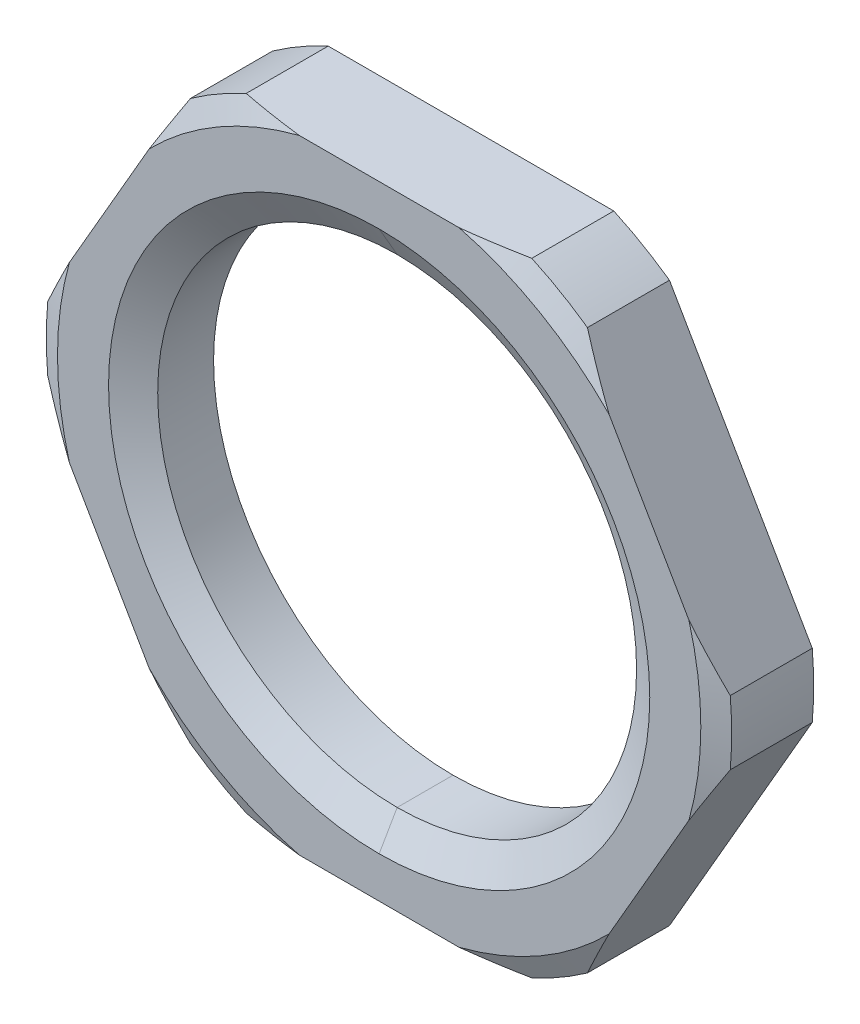
ISO-10303-21;
HEADER;
FILE_DESCRIPTION(('STEP AP214'),'2;1');
FILE_NAME('part.step','',(''),(''),'','','');
FILE_SCHEMA(('AUTOMOTIVE_DESIGN { 1 0 10303 214 1 1 1 1 }'));
ENDSEC;
DATA;
#1=APPLICATION_CONTEXT('core data for automotive mechanical design processes');
#2=APPLICATION_PROTOCOL_DEFINITION('international standard','automotive_design',2000,#1);
#3=PRODUCT_CONTEXT('',#1,'mechanical');
#4=PRODUCT('Part','Part','',(#3));
#5=PRODUCT_RELATED_PRODUCT_CATEGORY('part','',(#4));
#6=PRODUCT_DEFINITION_FORMATION('','',#4);
#7=PRODUCT_DEFINITION_CONTEXT('part definition',#1,'design');
#8=PRODUCT_DEFINITION('design','',#6,#7);
#9=PRODUCT_DEFINITION_SHAPE('','',#8);
#10=(LENGTH_UNIT() NAMED_UNIT(*) SI_UNIT(.MILLI.,.METRE.));
#11=(NAMED_UNIT(*) PLANE_ANGLE_UNIT() SI_UNIT($,.RADIAN.));
#12=(NAMED_UNIT(*) SI_UNIT($,.STERADIAN.) SOLID_ANGLE_UNIT());
#13=UNCERTAINTY_MEASURE_WITH_UNIT(LENGTH_MEASURE(1.E-05),#10,'distance_accuracy_value','');
#14=(GEOMETRIC_REPRESENTATION_CONTEXT(3) GLOBAL_UNCERTAINTY_ASSIGNED_CONTEXT((#13)) GLOBAL_UNIT_ASSIGNED_CONTEXT((#10,
#11,#12)) REPRESENTATION_CONTEXT('',''));
#15=CARTESIAN_POINT('',(0.,0.,0.));
#16=DIRECTION('',(0.,0.,1.));
#17=DIRECTION('',(1.,0.,0.));
#18=AXIS2_PLACEMENT_3D('',#15,#16,#17);
#19=CARTESIAN_POINT('',(10.40396479106,-0.979804381733,0.));
#20=DIRECTION('',(-0.866025403784429,0.500000000000017,0.));
#21=DIRECTION('',(0.,0.,1.));
#22=AXIS2_PLACEMENT_3D('',#19,#20,#21);
#23=PLANE('',#22);
#24=DIRECTION('',(-0.500000000000017,-0.866025403784429,0.));
#25=VECTOR('',#24,1.);
#26=CARTESIAN_POINT('',(9.443829136143,-2.642808118201,0.));
#27=LINE('',#26,#25);
#28=CARTESIAN_POINT('',(9.443829136143,-2.642808118201,0.));
#29=VERTEX_POINT('',#28);
#30=CARTESIAN_POINT('',(7.010653535761,-6.857191881799,0.));
#31=VERTEX_POINT('',#30);
#32=EDGE_CURVE('E427',#29,#31,#27,.T.);
#33=ORIENTED_EDGE('',*,*,#32,.T.);
#34=CARTESIAN_POINT('',(7.010653535761,-6.857191881799,0.));
#35=CARTESIAN_POINT('',(6.904427587513,-7.041180621247,-0.02458023492335));
#36=CARTESIAN_POINT('',(6.69169985566,-7.409635860995,-0.07986290593623));
#37=CARTESIAN_POINT('',(6.372595744954,-7.962340393642,-0.1799982415506));
#38=CARTESIAN_POINT('',(6.158086116641,-8.333881968593,-0.2582069995434));
#39=CARTESIAN_POINT('',(6.050517880848,-8.520195618267,-0.3));
#40=(BOUNDED_CURVE() B_SPLINE_CURVE(3,(#34,#35,#36,#37,#38,#39),.UNSPECIFIED.,.F.,
.F.) B_SPLINE_CURVE_WITH_KNOTS((4,1,1,4),(0.,0.3333333333333,0.6666666666667,1.),
.UNSPECIFIED.) CURVE() GEOMETRIC_REPRESENTATION_ITEM() RATIONAL_B_SPLINE_CURVE((1.,1.,1.,1.,1.,1.)) REPRESENTATION_ITEM(''));
#41=CARTESIAN_POINT('',(6.050517880848,-8.520195618267,-0.3));
#42=VERTEX_POINT('',#41);
#43=EDGE_CURVE('E417',#31,#42,#40,.T.);
#44=ORIENTED_EDGE('',*,*,#43,.T.);
#45=DIRECTION('',(0.,0.,-1.));
#46=VECTOR('',#45,1.);
#47=CARTESIAN_POINT('',(6.050517880848,-8.520195618267,-0.3));
#48=LINE('',#47,#46);
#49=CARTESIAN_POINT('',(6.050517880848,-8.520195618267,-2.8));
#50=VERTEX_POINT('',#49);
#51=EDGE_CURVE('E27',#42,#50,#48,.T.);
#52=ORIENTED_EDGE('',*,*,#51,.T.);
#53=DIRECTION('',(-0.500000000000017,-0.866025403784429,0.));
#54=VECTOR('',#53,1.);
#55=CARTESIAN_POINT('',(10.40396479106,-0.9798043817329,-2.8));
#56=LINE('',#55,#54);
#57=CARTESIAN_POINT('',(10.40396479106,-0.9798043817329,-2.8));
#58=VERTEX_POINT('',#57);
#59=EDGE_CURVE('E402',#58,#50,#56,.T.);
#60=ORIENTED_EDGE('',*,*,#59,.F.);
#61=DIRECTION('',(0.,0.,-1.));
#62=VECTOR('',#61,1.);
#63=CARTESIAN_POINT('',(10.40396479106,-0.9798043817329,-0.3));
#64=LINE('',#63,#62);
#65=CARTESIAN_POINT('',(10.40396479106,-0.9798043817329,-0.3));
#66=VERTEX_POINT('',#65);
#67=EDGE_CURVE('E433',#66,#58,#64,.T.);
#68=ORIENTED_EDGE('',*,*,#67,.F.);
#69=CARTESIAN_POINT('',(10.40396479106,-0.9798043817329,-0.3));
#70=CARTESIAN_POINT('',(10.29618146146,-1.166490584795,-0.2581234301219));
#71=CARTESIAN_POINT('',(10.08138362109,-1.538531357676,-0.1798240738233));
#72=CARTESIAN_POINT('',(9.762323554424,-2.091159603811,-0.07973500268764));
#73=CARTESIAN_POINT('',(9.549857941795,-2.459160839745,-0.02453461696096));
#74=CARTESIAN_POINT('',(9.443829136143,-2.642808118201,0.));
#75=(BOUNDED_CURVE() B_SPLINE_CURVE(3,(#69,#70,#71,#72,#73,#74),.UNSPECIFIED.,.F.,
.F.) B_SPLINE_CURVE_WITH_KNOTS((4,1,1,4),(0.,0.3333333333333,0.6666666666667,1.),
.UNSPECIFIED.) CURVE() GEOMETRIC_REPRESENTATION_ITEM() RATIONAL_B_SPLINE_CURVE((1.,1.,1.,1.,1.,1.)) REPRESENTATION_ITEM(''));
#76=EDGE_CURVE('E409',#66,#29,#75,.T.);
#77=ORIENTED_EDGE('',*,*,#76,.T.);
#78=EDGE_LOOP('',(#33,#44,#52,#60,#68,#77));
#79=FACE_BOUND('',#78,.T.);
#80=ADVANCED_FACE('F16',(#79),#23,.F.);
#81=CARTESIAN_POINT('',(6.050517880848,8.520195618267,0.));
#82=DIRECTION('',(-0.866025403784429,-0.500000000000017,0.));
#83=DIRECTION('',(-0.500000000000017,0.866025403784429,0.));
#84=AXIS2_PLACEMENT_3D('',#81,#82,#83);
#85=PLANE('',#84);
#86=DIRECTION('',(0.500000000000017,-0.866025403784429,0.));
#87=VECTOR('',#86,1.);
#88=CARTESIAN_POINT('',(7.010653535761,6.857191881799,0.));
#89=LINE('',#88,#87);
#90=CARTESIAN_POINT('',(7.010653535761,6.857191881799,0.));
#91=VERTEX_POINT('',#90);
#92=CARTESIAN_POINT('',(9.443829136143,2.642808118201,0.));
#93=VERTEX_POINT('',#92);
#94=EDGE_CURVE('E342',#91,#93,#89,.T.);
#95=ORIENTED_EDGE('',*,*,#94,.T.);
#96=CARTESIAN_POINT('',(9.443829136143,2.642808118201,0.));
#97=CARTESIAN_POINT('',(9.550055084391,2.458819378753,-0.02458023492335));
#98=CARTESIAN_POINT('',(9.762782816244,2.090364139005,-0.07986290593623));
#99=CARTESIAN_POINT('',(10.08188692695,1.537659606358,-0.1799982415506));
#100=CARTESIAN_POINT('',(10.29639655526,1.166118031407,-0.2582069995434));
#101=CARTESIAN_POINT('',(10.40396479106,0.979804381733,-0.3));
#102=(BOUNDED_CURVE() B_SPLINE_CURVE(3,(#96,#97,#98,#99,#100,#101),.UNSPECIFIED.,.F.,
.F.) B_SPLINE_CURVE_WITH_KNOTS((4,1,1,4),(0.,0.3333333333333,0.6666666666667,1.),
.UNSPECIFIED.) CURVE() GEOMETRIC_REPRESENTATION_ITEM() RATIONAL_B_SPLINE_CURVE((1.,1.,1.,1.,1.,1.)) REPRESENTATION_ITEM(''));
#103=CARTESIAN_POINT('',(10.40396479106,0.979804381733,-0.3));
#104=VERTEX_POINT('',#103);
#105=EDGE_CURVE('E356',#93,#104,#102,.T.);
#106=ORIENTED_EDGE('',*,*,#105,.T.);
#107=DIRECTION('',(0.,0.,-1.));
#108=VECTOR('',#107,1.);
#109=CARTESIAN_POINT('',(10.40396479106,0.979804381733,-0.3));
#110=LINE('',#109,#108);
#111=CARTESIAN_POINT('',(10.40396479106,0.9798043817329,-2.8));
#112=VERTEX_POINT('',#111);
#113=EDGE_CURVE('E372',#104,#112,#110,.T.);
#114=ORIENTED_EDGE('',*,*,#113,.T.);
#115=DIRECTION('',(0.500000000000017,-0.866025403784429,0.));
#116=VECTOR('',#115,1.);
#117=CARTESIAN_POINT('',(6.050517880848,8.520195618267,-2.8));
#118=LINE('',#117,#116);
#119=CARTESIAN_POINT('',(6.050517880848,8.520195618267,-2.8));
#120=VERTEX_POINT('',#119);
#121=EDGE_CURVE('E330',#120,#112,#118,.T.);
#122=ORIENTED_EDGE('',*,*,#121,.F.);
#123=DIRECTION('',(0.,0.,-1.));
#124=VECTOR('',#123,1.);
#125=CARTESIAN_POINT('',(6.050517880848,8.520195618267,-0.3));
#126=LINE('',#125,#124);
#127=CARTESIAN_POINT('',(6.050517880848,8.520195618267,-0.3));
#128=VERTEX_POINT('',#127);
#129=EDGE_CURVE('E11',#128,#120,#126,.T.);
#130=ORIENTED_EDGE('',*,*,#129,.F.);
#131=CARTESIAN_POINT('',(6.050517880848,8.520195618267,-0.3));
#132=CARTESIAN_POINT('',(6.15830121044,8.333509415205,-0.2581234301219));
#133=CARTESIAN_POINT('',(6.373099050813,7.961468642324,-0.1798240738233));
#134=CARTESIAN_POINT('',(6.69215911748,7.408840396189,-0.07973500268764));
#135=CARTESIAN_POINT('',(6.904624730109,7.040839160255,-0.02453461696096));
#136=CARTESIAN_POINT('',(7.010653535761,6.857191881799,0.));
#137=(BOUNDED_CURVE() B_SPLINE_CURVE(3,(#131,#132,#133,#134,#135,#136),.UNSPECIFIED.,.F.,
.F.) B_SPLINE_CURVE_WITH_KNOTS((4,1,1,4),(0.,0.3333333333333,0.6666666666667,1.),
.UNSPECIFIED.) CURVE() GEOMETRIC_REPRESENTATION_ITEM() RATIONAL_B_SPLINE_CURVE((1.,1.,1.,1.,1.,1.)) REPRESENTATION_ITEM(''));
#138=EDGE_CURVE('E263',#128,#91,#137,.T.);
#139=ORIENTED_EDGE('',*,*,#138,.T.);
#140=EDGE_LOOP('',(#95,#106,#114,#122,#130,#139));
#141=FACE_BOUND('',#140,.T.);
#142=ADVANCED_FACE('F527',(#141),#85,.F.);
#143=CARTESIAN_POINT('',(0.,0.,0.14));
#144=DIRECTION('',(0.,0.,-1.));
#145=DIRECTION('',(0.,-1.,0.));
#146=AXIS2_PLACEMENT_3D('',#143,#144,#145);
#147=CYLINDRICAL_SURFACE('',#146,10.45);
#148=ORIENTED_EDGE('',*,*,#129,.T.);
#149=CARTESIAN_POINT('',(0.,0.,-2.8));
#150=DIRECTION('',(0.,0.,-1.));
#151=DIRECTION('',(0.416597790450509,0.909090909090919,0.));
#152=AXIS2_PLACEMENT_3D('',#149,#150,#151);
#153=CIRCLE('',#152,10.45);
#154=CARTESIAN_POINT('',(4.353446910208,9.5,-2.8));
#155=VERTEX_POINT('',#154);
#156=EDGE_CURVE('E246',#155,#120,#153,.T.);
#157=ORIENTED_EDGE('',*,*,#156,.F.);
#158=DIRECTION('',(0.,0.,-1.));
#159=VECTOR('',#158,1.);
#160=CARTESIAN_POINT('',(4.353446910208,9.5,-0.3));
#161=LINE('',#160,#159);
#162=CARTESIAN_POINT('',(4.353446910208,9.5,-0.3));
#163=VERTEX_POINT('',#162);
#164=EDGE_CURVE('E170',#163,#155,#161,.T.);
#165=ORIENTED_EDGE('',*,*,#164,.F.);
#166=CARTESIAN_POINT('',(0.,0.,-0.3));
#167=DIRECTION('',(0.,0.,-1.));
#168=DIRECTION('',(0.416597790450509,0.909090909090919,0.));
#169=AXIS2_PLACEMENT_3D('',#166,#167,#168);
#170=CIRCLE('',#169,10.45);
#171=EDGE_CURVE('E254',#163,#128,#170,.T.);
#172=ORIENTED_EDGE('',*,*,#171,.T.);
#173=EDGE_LOOP('',(#148,#157,#165,#172));
#174=FACE_BOUND('',#173,.T.);
#175=ADVANCED_FACE('F584',(#174),#147,.T.);
#176=CARTESIAN_POINT('',(0.,0.,0.14));
#177=DIRECTION('',(0.,0.,-1.));
#178=DIRECTION('',(0.,-1.,0.));
#179=AXIS2_PLACEMENT_3D('',#176,#177,#178);
#180=CYLINDRICAL_SURFACE('',#179,10.45);
#181=DIRECTION('',(0.,0.,-1.));
#182=VECTOR('',#181,1.);
#183=CARTESIAN_POINT('',(4.353446910208,-9.5,-0.3));
#184=LINE('',#183,#182);
#185=CARTESIAN_POINT('',(4.353446910208,-9.5,-0.3));
#186=VERTEX_POINT('',#185);
#187=CARTESIAN_POINT('',(4.353446910208,-9.5,-2.8));
#188=VERTEX_POINT('',#187);
#189=EDGE_CURVE('E264',#186,#188,#184,.T.);
#190=ORIENTED_EDGE('',*,*,#189,.T.);
#191=CARTESIAN_POINT('',(0.,0.,-2.8));
#192=DIRECTION('',(0.,0.,-1.));
#193=DIRECTION('',(0.578996926396975,-0.815329724236064,0.));
#194=AXIS2_PLACEMENT_3D('',#191,#192,#193);
#195=CIRCLE('',#194,10.45);
#196=EDGE_CURVE('E285',#50,#188,#195,.T.);
#197=ORIENTED_EDGE('',*,*,#196,.F.);
#198=ORIENTED_EDGE('',*,*,#51,.F.);
#199=CARTESIAN_POINT('',(0.,0.,-0.3));
#200=DIRECTION('',(0.,0.,-1.));
#201=DIRECTION('',(0.578996926396975,-0.815329724236064,0.));
#202=AXIS2_PLACEMENT_3D('',#199,#200,#201);
#203=CIRCLE('',#202,10.45);
#204=EDGE_CURVE('E365',#42,#186,#203,.T.);
#205=ORIENTED_EDGE('',*,*,#204,.T.);
#206=EDGE_LOOP('',(#190,#197,#198,#205));
#207=FACE_BOUND('',#206,.T.);
#208=ADVANCED_FACE('F608',(#207),#180,.T.);
#209=CARTESIAN_POINT('',(0.,0.,0.14));
#210=DIRECTION('',(0.,0.,-1.));
#211=DIRECTION('',(0.,-1.,0.));
#212=AXIS2_PLACEMENT_3D('',#209,#210,#211);
#213=CYLINDRICAL_SURFACE('',#212,10.45);
#214=ORIENTED_EDGE('',*,*,#67,.T.);
#215=CARTESIAN_POINT('',(0.,0.,-2.8));
#216=DIRECTION('',(0.,0.,-1.));
#217=DIRECTION('',(0.995594716847482,0.0937611848548283,0.));
#218=AXIS2_PLACEMENT_3D('',#215,#216,#217);
#219=CIRCLE('',#218,10.45);
#220=EDGE_CURVE('E334',#112,#58,#219,.T.);
#221=ORIENTED_EDGE('',*,*,#220,.F.);
#222=ORIENTED_EDGE('',*,*,#113,.F.);
#223=CARTESIAN_POINT('',(0.,0.,-0.3));
#224=DIRECTION('',(0.,0.,-1.));
#225=DIRECTION('',(0.995594716847482,0.0937611848548283,0.));
#226=AXIS2_PLACEMENT_3D('',#223,#224,#225);
#227=CIRCLE('',#226,10.45);
#228=EDGE_CURVE('E366',#104,#66,#227,.T.);
#229=ORIENTED_EDGE('',*,*,#228,.T.);
#230=EDGE_LOOP('',(#214,#221,#222,#229));
#231=FACE_BOUND('',#230,.T.);
#232=ADVANCED_FACE('F611',(#231),#213,.T.);
#233=CARTESIAN_POINT('',(-10.40396479106,0.979804381733,0.));
#234=DIRECTION('',(0.866025403784429,-0.500000000000017,0.));
#235=DIRECTION('',(0.,0.,-1.));
#236=AXIS2_PLACEMENT_3D('',#233,#234,#235);
#237=PLANE('',#236);
#238=DIRECTION('',(0.500000000000017,0.866025403784429,0.));
#239=VECTOR('',#238,1.);
#240=CARTESIAN_POINT('',(-9.443829136143,2.642808118201,0.));
#241=LINE('',#240,#239);
#242=CARTESIAN_POINT('',(-9.443829136143,2.642808118201,0.));
#243=VERTEX_POINT('',#242);
#244=CARTESIAN_POINT('',(-7.010653535761,6.857191881799,0.));
#245=VERTEX_POINT('',#244);
#246=EDGE_CURVE('E272',#243,#245,#241,.T.);
#247=ORIENTED_EDGE('',*,*,#246,.T.);
#248=CARTESIAN_POINT('',(-7.010653535761,6.857191881799,0.));
#249=CARTESIAN_POINT('',(-6.904427587513,7.041180621247,-0.02458023492335));
#250=CARTESIAN_POINT('',(-6.69169985566,7.409635860995,-0.07986290593623));
#251=CARTESIAN_POINT('',(-6.372595744954,7.962340393642,-0.1799982415506));
#252=CARTESIAN_POINT('',(-6.158086116641,8.333881968593,-0.2582069995434));
#253=CARTESIAN_POINT('',(-6.050517880848,8.520195618267,-0.3));
#254=(BOUNDED_CURVE() B_SPLINE_CURVE(3,(#248,#249,#250,#251,#252,#253),.UNSPECIFIED.,.F.,
.F.) B_SPLINE_CURVE_WITH_KNOTS((4,1,1,4),(0.,0.3333333333333,0.6666666666667,1.),
.UNSPECIFIED.) CURVE() GEOMETRIC_REPRESENTATION_ITEM() RATIONAL_B_SPLINE_CURVE((1.,1.,1.,1.,1.,1.)) REPRESENTATION_ITEM(''));
#255=CARTESIAN_POINT('',(-6.050517880848,8.520195618267,-0.3));
#256=VERTEX_POINT('',#255);
#257=EDGE_CURVE('E351',#245,#256,#254,.T.);
#258=ORIENTED_EDGE('',*,*,#257,.T.);
#259=DIRECTION('',(0.,0.,-1.));
#260=VECTOR('',#259,1.);
#261=CARTESIAN_POINT('',(-6.050517880848,8.520195618267,-0.3));
#262=LINE('',#261,#260);
#263=CARTESIAN_POINT('',(-6.050517880848,8.520195618267,-2.8));
#264=VERTEX_POINT('',#263);
#265=EDGE_CURVE('E423',#256,#264,#262,.T.);
#266=ORIENTED_EDGE('',*,*,#265,.T.);
#267=DIRECTION('',(0.500000000000017,0.866025403784429,0.));
#268=VECTOR('',#267,1.);
#269=CARTESIAN_POINT('',(-10.40396479106,0.979804381733,-2.8));
#270=LINE('',#269,#268);
#271=CARTESIAN_POINT('',(-10.40396479106,0.979804381733,-2.8));
#272=VERTEX_POINT('',#271);
#273=EDGE_CURVE('E448',#272,#264,#270,.T.);
#274=ORIENTED_EDGE('',*,*,#273,.F.);
#275=DIRECTION('',(0.,0.,-1.));
#276=VECTOR('',#275,1.);
#277=CARTESIAN_POINT('',(-10.40396479106,0.979804381733,-0.3));
#278=LINE('',#277,#276);
#279=CARTESIAN_POINT('',(-10.40396479106,0.979804381733,-0.3));
#280=VERTEX_POINT('',#279);
#281=EDGE_CURVE('E41',#280,#272,#278,.T.);
#282=ORIENTED_EDGE('',*,*,#281,.F.);
#283=CARTESIAN_POINT('',(-10.40396479106,0.979804381733,-0.3));
#284=CARTESIAN_POINT('',(-10.29618146146,1.166490584795,-0.2581234301219));
#285=CARTESIAN_POINT('',(-10.08138362109,1.538531357676,-0.1798240738233));
#286=CARTESIAN_POINT('',(-9.762323554424,2.091159603811,-0.07973500268764));
#287=CARTESIAN_POINT('',(-9.549857941795,2.459160839745,-0.02453461696096));
#288=CARTESIAN_POINT('',(-9.443829136143,2.642808118201,0.));
#289=(BOUNDED_CURVE() B_SPLINE_CURVE(3,(#283,#284,#285,#286,#287,#288),.UNSPECIFIED.,.F.,
.F.) B_SPLINE_CURVE_WITH_KNOTS((4,1,1,4),(0.,0.3333333333333,0.6666666666667,1.),
.UNSPECIFIED.) CURVE() GEOMETRIC_REPRESENTATION_ITEM() RATIONAL_B_SPLINE_CURVE((1.,1.,1.,1.,1.,1.)) REPRESENTATION_ITEM(''));
#290=EDGE_CURVE('E292',#280,#243,#289,.T.);
#291=ORIENTED_EDGE('',*,*,#290,.T.);
#292=EDGE_LOOP('',(#247,#258,#266,#274,#282,#291));
#293=FACE_BOUND('',#292,.T.);
#294=ADVANCED_FACE('F454',(#293),#237,.F.);
#295=CARTESIAN_POINT('',(-6.050517880848,-8.520195618267,0.));
#296=DIRECTION('',(0.866025403784429,0.500000000000017,0.));
#297=DIRECTION('',(0.,0.,-1.));
#298=AXIS2_PLACEMENT_3D('',#295,#296,#297);
#299=PLANE('',#298);
#300=DIRECTION('',(-0.500000000000017,0.866025403784429,0.));
#301=VECTOR('',#300,1.);
#302=CARTESIAN_POINT('',(-7.010653535761,-6.857191881799,0.));
#303=LINE('',#302,#301);
#304=CARTESIAN_POINT('',(-7.010653535761,-6.857191881799,0.));
#305=VERTEX_POINT('',#304);
#306=CARTESIAN_POINT('',(-9.443829136143,-2.642808118201,0.));
#307=VERTEX_POINT('',#306);
#308=EDGE_CURVE('E298',#305,#307,#303,.T.);
#309=ORIENTED_EDGE('',*,*,#308,.T.);
#310=CARTESIAN_POINT('',(-9.443829136143,-2.642808118201,0.));
#311=CARTESIAN_POINT('',(-9.550055084391,-2.458819378753,-0.02458023492335));
#312=CARTESIAN_POINT('',(-9.762782816244,-2.090364139005,-0.07986290593623));
#313=CARTESIAN_POINT('',(-10.08188692695,-1.537659606358,-0.1799982415506));
#314=CARTESIAN_POINT('',(-10.29639655526,-1.166118031407,-0.2582069995434));
#315=CARTESIAN_POINT('',(-10.40396479106,-0.979804381733,-0.3));
#316=(BOUNDED_CURVE() B_SPLINE_CURVE(3,(#310,#311,#312,#313,#314,#315),.UNSPECIFIED.,.F.,
.F.) B_SPLINE_CURVE_WITH_KNOTS((4,1,1,4),(0.,0.3333333333333,0.6666666666667,1.),
.UNSPECIFIED.) CURVE() GEOMETRIC_REPRESENTATION_ITEM() RATIONAL_B_SPLINE_CURVE((1.,1.,1.,1.,1.,1.)) REPRESENTATION_ITEM(''));
#317=CARTESIAN_POINT('',(-10.40396479106,-0.979804381733,-0.3));
#318=VERTEX_POINT('',#317);
#319=EDGE_CURVE('E290',#307,#318,#316,.T.);
#320=ORIENTED_EDGE('',*,*,#319,.T.);
#321=DIRECTION('',(0.,0.,-1.));
#322=VECTOR('',#321,1.);
#323=CARTESIAN_POINT('',(-10.40396479106,-0.979804381733,-0.3));
#324=LINE('',#323,#322);
#325=CARTESIAN_POINT('',(-10.40396479106,-0.979804381733,-2.8));
#326=VERTEX_POINT('',#325);
#327=EDGE_CURVE('E395',#318,#326,#324,.T.);
#328=ORIENTED_EDGE('',*,*,#327,.T.);
#329=DIRECTION('',(-0.500000000000017,0.866025403784429,0.));
#330=VECTOR('',#329,1.);
#331=CARTESIAN_POINT('',(-6.050517880848,-8.520195618267,-2.8));
#332=LINE('',#331,#330);
#333=CARTESIAN_POINT('',(-6.050517880848,-8.520195618267,-2.8));
#334=VERTEX_POINT('',#333);
#335=EDGE_CURVE('E316',#334,#326,#332,.T.);
#336=ORIENTED_EDGE('',*,*,#335,.F.);
#337=DIRECTION('',(0.,0.,-1.));
#338=VECTOR('',#337,1.);
#339=CARTESIAN_POINT('',(-6.050517880848,-8.520195618267,-0.3));
#340=LINE('',#339,#338);
#341=CARTESIAN_POINT('',(-6.050517880848,-8.520195618267,-0.3));
#342=VERTEX_POINT('',#341);
#343=EDGE_CURVE('E339',#342,#334,#340,.T.);
#344=ORIENTED_EDGE('',*,*,#343,.F.);
#345=CARTESIAN_POINT('',(-6.050517880848,-8.520195618267,-0.3));
#346=CARTESIAN_POINT('',(-6.15830121044,-8.333509415205,-0.2581234301219));
#347=CARTESIAN_POINT('',(-6.373099050813,-7.961468642324,-0.1798240738233));
#348=CARTESIAN_POINT('',(-6.69215911748,-7.408840396189,-0.07973500268764));
#349=CARTESIAN_POINT('',(-6.904624730109,-7.040839160255,-0.02453461696096));
#350=CARTESIAN_POINT('',(-7.010653535761,-6.857191881799,0.));
#351=(BOUNDED_CURVE() B_SPLINE_CURVE(3,(#345,#346,#347,#348,#349,#350),.UNSPECIFIED.,.F.,
.F.) B_SPLINE_CURVE_WITH_KNOTS((4,1,1,4),(0.,0.3333333333333,0.6666666666667,1.),
.UNSPECIFIED.) CURVE() GEOMETRIC_REPRESENTATION_ITEM() RATIONAL_B_SPLINE_CURVE((1.,1.,1.,1.,1.,1.)) REPRESENTATION_ITEM(''));
#352=EDGE_CURVE('E291',#342,#305,#351,.T.);
#353=ORIENTED_EDGE('',*,*,#352,.T.);
#354=EDGE_LOOP('',(#309,#320,#328,#336,#344,#353));
#355=FACE_BOUND('',#354,.T.);
#356=ADVANCED_FACE('F710',(#355),#299,.F.);
#357=CARTESIAN_POINT('',(0.,0.,0.14));
#358=DIRECTION('',(0.,0.,-1.));
#359=DIRECTION('',(0.,-1.,0.));
#360=AXIS2_PLACEMENT_3D('',#357,#358,#359);
#361=CYLINDRICAL_SURFACE('',#360,10.45);
#362=DIRECTION('',(0.,0.,-1.));
#363=VECTOR('',#362,1.);
#364=CARTESIAN_POINT('',(-4.353446910208,9.5,-0.3));
#365=LINE('',#364,#363);
#366=CARTESIAN_POINT('',(-4.353446910208,9.5,-0.3));
#367=VERTEX_POINT('',#366);
#368=CARTESIAN_POINT('',(-4.353446910208,9.5,-2.8));
#369=VERTEX_POINT('',#368);
#370=EDGE_CURVE('E335',#367,#369,#365,.T.);
#371=ORIENTED_EDGE('',*,*,#370,.T.);
#372=CARTESIAN_POINT('',(0.,0.,-2.8));
#373=DIRECTION('',(0.,0.,1.));
#374=DIRECTION('',(-0.416597790450509,0.909090909090919,0.));
#375=AXIS2_PLACEMENT_3D('',#372,#373,#374);
#376=CIRCLE('',#375,10.45);
#377=EDGE_CURVE('E247',#369,#264,#376,.T.);
#378=ORIENTED_EDGE('',*,*,#377,.T.);
#379=ORIENTED_EDGE('',*,*,#265,.F.);
#380=CARTESIAN_POINT('',(0.,0.,-0.3));
#381=DIRECTION('',(0.,0.,-1.));
#382=DIRECTION('',(-0.578996926396975,0.815329724236064,0.));
#383=AXIS2_PLACEMENT_3D('',#380,#381,#382);
#384=CIRCLE('',#383,10.45);
#385=EDGE_CURVE('E347',#256,#367,#384,.T.);
#386=ORIENTED_EDGE('',*,*,#385,.T.);
#387=EDGE_LOOP('',(#371,#378,#379,#386));
#388=FACE_BOUND('',#387,.T.);
#389=ADVANCED_FACE('F460',(#388),#361,.T.);
#390=CARTESIAN_POINT('',(0.,0.,0.14));
#391=DIRECTION('',(0.,0.,-1.));
#392=DIRECTION('',(0.,-1.,0.));
#393=AXIS2_PLACEMENT_3D('',#390,#391,#392);
#394=CYLINDRICAL_SURFACE('',#393,10.45);
#395=ORIENTED_EDGE('',*,*,#281,.T.);
#396=CARTESIAN_POINT('',(0.,0.,-2.8));
#397=DIRECTION('',(0.,0.,1.));
#398=DIRECTION('',(-0.995594716847482,0.0937611848548283,0.));
#399=AXIS2_PLACEMENT_3D('',#396,#397,#398);
#400=CIRCLE('',#399,10.45);
#401=EDGE_CURVE('E323',#272,#326,#400,.T.);
#402=ORIENTED_EDGE('',*,*,#401,.T.);
#403=ORIENTED_EDGE('',*,*,#327,.F.);
#404=CARTESIAN_POINT('',(0.,0.,-0.3));
#405=DIRECTION('',(0.,0.,-1.));
#406=DIRECTION('',(-0.995594716847482,-0.0937611848548283,0.));
#407=AXIS2_PLACEMENT_3D('',#404,#405,#406);
#408=CIRCLE('',#407,10.45);
#409=EDGE_CURVE('E297',#318,#280,#408,.T.);
#410=ORIENTED_EDGE('',*,*,#409,.T.);
#411=EDGE_LOOP('',(#395,#402,#403,#410));
#412=FACE_BOUND('',#411,.T.);
#413=ADVANCED_FACE('F606',(#412),#394,.T.);
#414=CARTESIAN_POINT('',(0.,0.,0.14));
#415=DIRECTION('',(0.,0.,-1.));
#416=DIRECTION('',(0.,-1.,0.));
#417=AXIS2_PLACEMENT_3D('',#414,#415,#416);
#418=CYLINDRICAL_SURFACE('',#417,10.45);
#419=ORIENTED_EDGE('',*,*,#343,.T.);
#420=CARTESIAN_POINT('',(0.,0.,-2.8));
#421=DIRECTION('',(0.,0.,1.));
#422=DIRECTION('',(-0.578996926396975,-0.815329724236064,0.));
#423=AXIS2_PLACEMENT_3D('',#420,#421,#422);
#424=CIRCLE('',#423,10.45);
#425=CARTESIAN_POINT('',(-4.353446910208,-9.5,-2.8));
#426=VERTEX_POINT('',#425);
#427=EDGE_CURVE('E324',#334,#426,#424,.T.);
#428=ORIENTED_EDGE('',*,*,#427,.T.);
#429=DIRECTION('',(0.,0.,-1.));
#430=VECTOR('',#429,1.);
#431=CARTESIAN_POINT('',(-4.353446910208,-9.5,-0.3));
#432=LINE('',#431,#430);
#433=CARTESIAN_POINT('',(-4.353446910208,-9.5,-0.3));
#434=VERTEX_POINT('',#433);
#435=EDGE_CURVE('E20',#434,#426,#432,.T.);
#436=ORIENTED_EDGE('',*,*,#435,.F.);
#437=CARTESIAN_POINT('',(0.,0.,-0.3));
#438=DIRECTION('',(0.,0.,-1.));
#439=DIRECTION('',(-0.416597790450509,-0.909090909090919,0.));
#440=AXIS2_PLACEMENT_3D('',#437,#438,#439);
#441=CIRCLE('',#440,10.45);
#442=EDGE_CURVE('E286',#434,#342,#441,.T.);
#443=ORIENTED_EDGE('',*,*,#442,.T.);
#444=EDGE_LOOP('',(#419,#428,#436,#443));
#445=FACE_BOUND('',#444,.T.);
#446=ADVANCED_FACE('F593',(#445),#418,.T.);
#447=CARTESIAN_POINT('',(-4.353446910208,9.5,0.));
#448=DIRECTION('',(0.,-1.,0.));
#449=DIRECTION('',(0.,0.,-1.));
#450=AXIS2_PLACEMENT_3D('',#447,#448,#449);
#451=PLANE('',#450);
#452=DIRECTION('',(1.,0.,0.));
#453=VECTOR('',#452,1.);
#454=CARTESIAN_POINT('',(-2.433175600382,9.5,0.));
#455=LINE('',#454,#453);
#456=CARTESIAN_POINT('',(-2.433175600382,9.5,0.));
#457=VERTEX_POINT('',#456);
#458=CARTESIAN_POINT('',(2.433175600382,9.5,0.));
#459=VERTEX_POINT('',#458);
#460=EDGE_CURVE('E273',#457,#459,#455,.T.);
#461=ORIENTED_EDGE('',*,*,#460,.T.);
#462=CARTESIAN_POINT('',(2.433175600382,9.5,0.));
#463=CARTESIAN_POINT('',(2.645627496877,9.5,-0.02458023492335));
#464=CARTESIAN_POINT('',(3.071082960583,9.5,-0.07986290593623));
#465=CARTESIAN_POINT('',(3.709291181996,9.5,-0.1799982415506));
#466=CARTESIAN_POINT('',(4.138310438622,9.5,-0.2582069995434));
#467=CARTESIAN_POINT('',(4.353446910208,9.5,-0.3));
#468=(BOUNDED_CURVE() B_SPLINE_CURVE(3,(#462,#463,#464,#465,#466,#467),.UNSPECIFIED.,.F.,
.F.) B_SPLINE_CURVE_WITH_KNOTS((4,1,1,4),(0.,0.3333333333333,0.6666666666667,1.),
.UNSPECIFIED.) CURVE() GEOMETRIC_REPRESENTATION_ITEM() RATIONAL_B_SPLINE_CURVE((1.,1.,1.,1.,1.,1.)) REPRESENTATION_ITEM(''));
#469=EDGE_CURVE('E248',#459,#163,#468,.T.);
#470=ORIENTED_EDGE('',*,*,#469,.T.);
#471=ORIENTED_EDGE('',*,*,#164,.T.);
#472=DIRECTION('',(1.,0.,0.));
#473=VECTOR('',#472,1.);
#474=CARTESIAN_POINT('',(-4.353446910208,9.5,-2.8));
#475=LINE('',#474,#473);
#476=EDGE_CURVE('E242',#369,#155,#475,.T.);
#477=ORIENTED_EDGE('',*,*,#476,.F.);
#478=ORIENTED_EDGE('',*,*,#370,.F.);
#479=CARTESIAN_POINT('',(-4.353446910208,9.5,-0.3));
#480=CARTESIAN_POINT('',(-4.137880251024,9.5,-0.2581234301219));
#481=CARTESIAN_POINT('',(-3.708284570279,9.5,-0.1798240738233));
#482=CARTESIAN_POINT('',(-3.070164436944,9.5,-0.07973500268764));
#483=CARTESIAN_POINT('',(-2.645233211686,9.5,-0.02453461696096));
#484=CARTESIAN_POINT('',(-2.433175600382,9.5,0.));
#485=(BOUNDED_CURVE() B_SPLINE_CURVE(3,(#479,#480,#481,#482,#483,#484),.UNSPECIFIED.,.F.,
.F.) B_SPLINE_CURVE_WITH_KNOTS((4,1,1,4),(0.,0.3333333333333,0.6666666666667,1.),
.UNSPECIFIED.) CURVE() GEOMETRIC_REPRESENTATION_ITEM() RATIONAL_B_SPLINE_CURVE((1.,1.,1.,1.,1.,1.)) REPRESENTATION_ITEM(''));
#486=EDGE_CURVE('E253',#367,#457,#485,.T.);
#487=ORIENTED_EDGE('',*,*,#486,.T.);
#488=EDGE_LOOP('',(#461,#470,#471,#477,#478,#487));
#489=FACE_BOUND('',#488,.T.);
#490=ADVANCED_FACE('F589',(#489),#451,.F.);
#491=CARTESIAN_POINT('',(0.,0.,-0.15));
#492=DIRECTION('',(0.,0.,-1.));
#493=DIRECTION('',(1.,0.,0.));
#494=AXIS2_PLACEMENT_3D('',#491,#492,#493);
#495=CONICAL_SURFACE('',#494,10.12832396192,1.1344640137961);
#496=ORIENTED_EDGE('',*,*,#319,.F.);
#497=CARTESIAN_POINT('',(0.,0.,0.));
#498=DIRECTION('',(0.,0.,1.));
#499=DIRECTION('',(-0.963002772147894,0.269491485645598,0.));
#500=AXIS2_PLACEMENT_3D('',#497,#498,#499);
#501=CIRCLE('',#500,9.806647923847);
#502=EDGE_CURVE('E234',#243,#307,#501,.T.);
#503=ORIENTED_EDGE('',*,*,#502,.F.);
#504=ORIENTED_EDGE('',*,*,#290,.F.);
#505=ORIENTED_EDGE('',*,*,#409,.F.);
#506=EDGE_LOOP('',(#496,#503,#504,#505));
#507=FACE_BOUND('',#506,.T.);
#508=ADVANCED_FACE('F592',(#507),#495,.T.);
#509=CARTESIAN_POINT('',(0.,0.,-0.15));
#510=DIRECTION('',(0.,0.,-1.));
#511=DIRECTION('',(1.,0.,0.));
#512=AXIS2_PLACEMENT_3D('',#509,#510,#511);
#513=CONICAL_SURFACE('',#512,10.12832396192,1.1344640137961);
#514=ORIENTED_EDGE('',*,*,#352,.F.);
#515=ORIENTED_EDGE('',*,*,#442,.F.);
#516=CARTESIAN_POINT('',(-2.433175600382,-9.5,0.));
#517=CARTESIAN_POINT('',(-2.645627496877,-9.5,-0.02458023492335));
#518=CARTESIAN_POINT('',(-3.071082960583,-9.5,-0.07986290593623));
#519=CARTESIAN_POINT('',(-3.709291181996,-9.5,-0.1799982415506));
#520=CARTESIAN_POINT('',(-4.138310438622,-9.5,-0.2582069995434));
#521=CARTESIAN_POINT('',(-4.353446910208,-9.5,-0.3));
#522=(BOUNDED_CURVE() B_SPLINE_CURVE(3,(#516,#517,#518,#519,#520,#521),.UNSPECIFIED.,.F.,
.F.) B_SPLINE_CURVE_WITH_KNOTS((4,1,1,4),(0.,0.3333333333333,0.6666666666667,1.),
.UNSPECIFIED.) CURVE() GEOMETRIC_REPRESENTATION_ITEM() RATIONAL_B_SPLINE_CURVE((1.,1.,1.,1.,1.,1.)) REPRESENTATION_ITEM(''));
#523=CARTESIAN_POINT('',(-2.433175600382,-9.5,0.));
#524=VERTEX_POINT('',#523);
#525=EDGE_CURVE('E284',#524,#434,#522,.T.);
#526=ORIENTED_EDGE('',*,*,#525,.F.);
#527=CARTESIAN_POINT('',(0.,0.,0.));
#528=DIRECTION('',(0.,0.,-1.));
#529=DIRECTION('',(-0.2481149134013,-0.9687306074177,0.));
#530=AXIS2_PLACEMENT_3D('',#527,#528,#529);
#531=CIRCLE('',#530,9.806647923847);
#532=EDGE_CURVE('E279',#524,#305,#531,.T.);
#533=ORIENTED_EDGE('',*,*,#532,.T.);
#534=EDGE_LOOP('',(#514,#515,#526,#533));
#535=FACE_BOUND('',#534,.T.);
#536=ADVANCED_FACE('F614',(#535),#513,.T.);
#537=CARTESIAN_POINT('',(0.,0.,-0.15));
#538=DIRECTION('',(0.,0.,-1.));
#539=DIRECTION('',(1.,0.,0.));
#540=AXIS2_PLACEMENT_3D('',#537,#538,#539);
#541=CONICAL_SURFACE('',#540,10.12832396192,1.1344640137961);
#542=CARTESIAN_POINT('',(4.353446910208,-9.5,-0.3));
#543=CARTESIAN_POINT('',(4.137880251024,-9.5,-0.2581234301219));
#544=CARTESIAN_POINT('',(3.708284570279,-9.5,-0.1798240738233));
#545=CARTESIAN_POINT('',(3.070164436944,-9.5,-0.07973500268764));
#546=CARTESIAN_POINT('',(2.645233211686,-9.5,-0.02453461696096));
#547=CARTESIAN_POINT('',(2.433175600382,-9.5,0.));
#548=(BOUNDED_CURVE() B_SPLINE_CURVE(3,(#542,#543,#544,#545,#546,#547),.UNSPECIFIED.,.F.,
.F.) B_SPLINE_CURVE_WITH_KNOTS((4,1,1,4),(0.,0.3333333333333,0.6666666666667,1.),
.UNSPECIFIED.) CURVE() GEOMETRIC_REPRESENTATION_ITEM() RATIONAL_B_SPLINE_CURVE((1.,1.,1.,1.,1.,1.)) REPRESENTATION_ITEM(''));
#549=CARTESIAN_POINT('',(2.433175600382,-9.5,0.));
#550=VERTEX_POINT('',#549);
#551=EDGE_CURVE('E255',#186,#550,#548,.T.);
#552=ORIENTED_EDGE('',*,*,#551,.F.);
#553=ORIENTED_EDGE('',*,*,#204,.F.);
#554=ORIENTED_EDGE('',*,*,#43,.F.);
#555=CARTESIAN_POINT('',(0.,0.,0.));
#556=DIRECTION('',(0.,0.,-1.));
#557=DIRECTION('',(0.71488785874663,-0.699239121772129,0.));
#558=AXIS2_PLACEMENT_3D('',#555,#556,#557);
#559=CIRCLE('',#558,9.806647923847);
#560=EDGE_CURVE('E278',#31,#550,#559,.T.);
#561=ORIENTED_EDGE('',*,*,#560,.T.);
#562=EDGE_LOOP('',(#552,#553,#554,#561));
#563=FACE_BOUND('',#562,.T.);
#564=ADVANCED_FACE('F598',(#563),#541,.T.);
#565=CARTESIAN_POINT('',(0.,0.,-0.15));
#566=DIRECTION('',(0.,0.,-1.));
#567=DIRECTION('',(1.,0.,0.));
#568=AXIS2_PLACEMENT_3D('',#565,#566,#567);
#569=CONICAL_SURFACE('',#568,10.12832396192,1.1344640137961);
#570=ORIENTED_EDGE('',*,*,#76,.F.);
#571=ORIENTED_EDGE('',*,*,#228,.F.);
#572=ORIENTED_EDGE('',*,*,#105,.F.);
#573=CARTESIAN_POINT('',(0.,0.,0.));
#574=DIRECTION('',(0.,0.,1.));
#575=DIRECTION('',(0.963002772147894,-0.269491485645598,0.));
#576=AXIS2_PLACEMENT_3D('',#573,#574,#575);
#577=CIRCLE('',#576,9.806647923847);
#578=EDGE_CURVE('E486',#29,#93,#577,.T.);
#579=ORIENTED_EDGE('',*,*,#578,.F.);
#580=EDGE_LOOP('',(#570,#571,#572,#579));
#581=FACE_BOUND('',#580,.T.);
#582=ADVANCED_FACE('F595',(#581),#569,.T.);
#583=CARTESIAN_POINT('',(0.,0.,-0.15));
#584=DIRECTION('',(0.,0.,-1.));
#585=DIRECTION('',(1.,0.,0.));
#586=AXIS2_PLACEMENT_3D('',#583,#584,#585);
#587=CONICAL_SURFACE('',#586,10.12832396192,1.1344640137961);
#588=ORIENTED_EDGE('',*,*,#486,.F.);
#589=ORIENTED_EDGE('',*,*,#385,.F.);
#590=ORIENTED_EDGE('',*,*,#257,.F.);
#591=CARTESIAN_POINT('',(0.,0.,0.));
#592=DIRECTION('',(0.,0.,-1.));
#593=DIRECTION('',(-0.71488785874663,0.699239121772129,0.));
#594=AXIS2_PLACEMENT_3D('',#591,#592,#593);
#595=CIRCLE('',#594,9.806647923847);
#596=EDGE_CURVE('E265',#245,#457,#595,.T.);
#597=ORIENTED_EDGE('',*,*,#596,.T.);
#598=EDGE_LOOP('',(#588,#589,#590,#597));
#599=FACE_BOUND('',#598,.T.);
#600=ADVANCED_FACE('F18',(#599),#587,.T.);
#601=CARTESIAN_POINT('',(0.,0.,-0.15));
#602=DIRECTION('',(0.,0.,-1.));
#603=DIRECTION('',(1.,0.,0.));
#604=AXIS2_PLACEMENT_3D('',#601,#602,#603);
#605=CONICAL_SURFACE('',#604,10.12832396192,1.1344640137961);
#606=ORIENTED_EDGE('',*,*,#138,.F.);
#607=ORIENTED_EDGE('',*,*,#171,.F.);
#608=ORIENTED_EDGE('',*,*,#469,.F.);
#609=CARTESIAN_POINT('',(0.,0.,0.));
#610=DIRECTION('',(0.,0.,-1.));
#611=DIRECTION('',(0.2481149134013,0.9687306074177,0.));
#612=AXIS2_PLACEMENT_3D('',#609,#610,#611);
#613=CIRCLE('',#612,9.806647923847);
#614=EDGE_CURVE('E346',#459,#91,#613,.T.);
#615=ORIENTED_EDGE('',*,*,#614,.T.);
#616=EDGE_LOOP('',(#606,#607,#608,#615));
#617=FACE_BOUND('',#616,.T.);
#618=ADVANCED_FACE('F535',(#617),#605,.T.);
#619=CARTESIAN_POINT('',(4.353446910208,-9.5,0.));
#620=DIRECTION('',(0.,1.,0.));
#621=DIRECTION('',(1.,0.,0.));
#622=AXIS2_PLACEMENT_3D('',#619,#620,#621);
#623=PLANE('',#622);
#624=DIRECTION('',(-1.,0.,0.));
#625=VECTOR('',#624,1.);
#626=CARTESIAN_POINT('',(2.433175600382,-9.5,0.));
#627=LINE('',#626,#625);
#628=EDGE_CURVE('E274',#550,#524,#627,.T.);
#629=ORIENTED_EDGE('',*,*,#628,.T.);
#630=ORIENTED_EDGE('',*,*,#525,.T.);
#631=ORIENTED_EDGE('',*,*,#435,.T.);
#632=DIRECTION('',(-1.,0.,0.));
#633=VECTOR('',#632,1.);
#634=CARTESIAN_POINT('',(4.353446910208,-9.5,-2.8));
#635=LINE('',#634,#633);
#636=EDGE_CURVE('E280',#188,#426,#635,.T.);
#637=ORIENTED_EDGE('',*,*,#636,.F.);
#638=ORIENTED_EDGE('',*,*,#189,.F.);
#639=ORIENTED_EDGE('',*,*,#551,.T.);
#640=EDGE_LOOP('',(#629,#630,#631,#637,#638,#639));
#641=FACE_BOUND('',#640,.T.);
#642=ADVANCED_FACE('F567',(#641),#623,.F.);
#643=CARTESIAN_POINT('',(0.,0.,-2.8));
#644=DIRECTION('',(0.,0.,-1.));
#645=DIRECTION('',(0.,-1.,0.));
#646=AXIS2_PLACEMENT_3D('',#643,#644,#645);
#647=PLANE('',#646);
#648=CARTESIAN_POINT('',(0.,0.,-2.8));
#649=DIRECTION('',(0.,0.,-1.));
#650=DIRECTION('',(0.,1.,0.));
#651=AXIS2_PLACEMENT_3D('',#648,#649,#650);
#652=CIRCLE('',#651,8.25);
#653=CARTESIAN_POINT('',(0.,8.25,-2.8));
#654=VERTEX_POINT('',#653);
#655=CARTESIAN_POINT('',(0.,-8.25,-2.8));
#656=VERTEX_POINT('',#655);
#657=EDGE_CURVE('E237',#654,#656,#652,.T.);
#658=ORIENTED_EDGE('',*,*,#657,.F.);
#659=CARTESIAN_POINT('',(0.,0.,-2.8));
#660=DIRECTION('',(0.,0.,1.));
#661=DIRECTION('',(0.,1.,0.));
#662=AXIS2_PLACEMENT_3D('',#659,#660,#661);
#663=CIRCLE('',#662,8.25);
#664=EDGE_CURVE('E325',#654,#656,#663,.T.);
#665=ORIENTED_EDGE('',*,*,#664,.T.);
#666=EDGE_LOOP('',(#658,#665));
#667=FACE_BOUND('',#666,.T.);
#668=ORIENTED_EDGE('',*,*,#427,.F.);
#669=ORIENTED_EDGE('',*,*,#335,.T.);
#670=ORIENTED_EDGE('',*,*,#401,.F.);
#671=ORIENTED_EDGE('',*,*,#273,.T.);
#672=ORIENTED_EDGE('',*,*,#377,.F.);
#673=ORIENTED_EDGE('',*,*,#476,.T.);
#674=ORIENTED_EDGE('',*,*,#156,.T.);
#675=ORIENTED_EDGE('',*,*,#121,.T.);
#676=ORIENTED_EDGE('',*,*,#220,.T.);
#677=ORIENTED_EDGE('',*,*,#59,.T.);
#678=ORIENTED_EDGE('',*,*,#196,.T.);
#679=ORIENTED_EDGE('',*,*,#636,.T.);
#680=EDGE_LOOP('',(#668,#669,#670,#671,#672,#673,#674,#675,#676,#677,#678,#679));
#681=FACE_BOUND('',#680,.T.);
#682=ADVANCED_FACE('F464',(#667,#681),#647,.T.);
#683=CARTESIAN_POINT('',(0.,0.,-2.525758622135));
#684=DIRECTION('',(0.,0.,-1.));
#685=DIRECTION('',(0.,-1.,0.));
#686=AXIS2_PLACEMENT_3D('',#683,#684,#685);
#687=CONICAL_SURFACE('',#686,7.775,1.0471975511964);
#688=CARTESIAN_POINT('',(0.,0.,-2.25151724427));
#689=DIRECTION('',(0.,0.,1.));
#690=DIRECTION('',(0.,1.,0.));
#691=AXIS2_PLACEMENT_3D('',#688,#689,#690);
#692=CIRCLE('',#691,7.3);
#693=CARTESIAN_POINT('',(0.,7.3,-2.25151724427));
#694=VERTEX_POINT('',#693);
#695=CARTESIAN_POINT('',(0.,-7.3,-2.25151724427));
#696=VERTEX_POINT('',#695);
#697=EDGE_CURVE('E201',#694,#696,#692,.T.);
#698=ORIENTED_EDGE('',*,*,#697,.T.);
#699=DIRECTION('',(0.,-0.866025403784429,-0.500000000000017));
#700=VECTOR('',#699,1.);
#701=CARTESIAN_POINT('',(0.,-7.3,-2.25151724427));
#702=LINE('',#701,#700);
#703=EDGE_CURVE('E241',#696,#656,#702,.T.);
#704=ORIENTED_EDGE('',*,*,#703,.T.);
#705=ORIENTED_EDGE('',*,*,#664,.F.);
#706=DIRECTION('',(0.,0.866025403784429,-0.500000000000017));
#707=VECTOR('',#706,1.);
#708=CARTESIAN_POINT('',(0.,7.3,-2.25151724427));
#709=LINE('',#708,#707);
#710=EDGE_CURVE('E310',#694,#654,#709,.T.);
#711=ORIENTED_EDGE('',*,*,#710,.F.);
#712=EDGE_LOOP('',(#698,#704,#705,#711));
#713=FACE_BOUND('',#712,.T.);
#714=ADVANCED_FACE('F561',(#713),#687,.F.);
#715=CARTESIAN_POINT('',(0.,0.,-2.525758622135));
#716=DIRECTION('',(0.,0.,-1.));
#717=DIRECTION('',(0.,-1.,0.));
#718=AXIS2_PLACEMENT_3D('',#715,#716,#717);
#719=CONICAL_SURFACE('',#718,7.775,1.0471975511964);
#720=ORIENTED_EDGE('',*,*,#657,.T.);
#721=ORIENTED_EDGE('',*,*,#703,.F.);
#722=CARTESIAN_POINT('',(0.,0.,-2.25151724427));
#723=DIRECTION('',(0.,0.,-1.));
#724=DIRECTION('',(0.,1.,0.));
#725=AXIS2_PLACEMENT_3D('',#722,#723,#724);
#726=CIRCLE('',#725,7.3);
#727=EDGE_CURVE('E196',#694,#696,#726,.T.);
#728=ORIENTED_EDGE('',*,*,#727,.F.);
#729=ORIENTED_EDGE('',*,*,#710,.T.);
#730=EDGE_LOOP('',(#720,#721,#728,#729));
#731=FACE_BOUND('',#730,.T.);
#732=ADVANCED_FACE('F565',(#731),#719,.F.);
#733=CARTESIAN_POINT('',(0.,0.,0.14));
#734=DIRECTION('',(0.,0.,-1.));
#735=DIRECTION('',(0.,-1.,0.));
#736=AXIS2_PLACEMENT_3D('',#733,#734,#735);
#737=CYLINDRICAL_SURFACE('',#736,7.3);
#738=ORIENTED_EDGE('',*,*,#727,.T.);
#739=DIRECTION('',(0.,0.,-1.));
#740=VECTOR('',#739,1.);
#741=CARTESIAN_POINT('',(0.,-7.3,-0.5484827557301));
#742=LINE('',#741,#740);
#743=CARTESIAN_POINT('',(0.,-7.3,-0.5484827557301));
#744=VERTEX_POINT('',#743);
#745=EDGE_CURVE('E189',#744,#696,#742,.T.);
#746=ORIENTED_EDGE('',*,*,#745,.F.);
#747=CARTESIAN_POINT('',(0.,0.,-0.5484827557301));
#748=DIRECTION('',(0.,0.,-1.));
#749=DIRECTION('',(0.,1.,0.));
#750=AXIS2_PLACEMENT_3D('',#747,#748,#749);
#751=CIRCLE('',#750,7.3);
#752=CARTESIAN_POINT('',(0.,7.3,-0.5484827557301));
#753=VERTEX_POINT('',#752);
#754=EDGE_CURVE('E194',#753,#744,#751,.T.);
#755=ORIENTED_EDGE('',*,*,#754,.F.);
#756=DIRECTION('',(0.,0.,-1.));
#757=VECTOR('',#756,1.);
#758=CARTESIAN_POINT('',(0.,7.3,-0.5484827557301));
#759=LINE('',#758,#757);
#760=EDGE_CURVE('E207',#753,#694,#759,.T.);
#761=ORIENTED_EDGE('',*,*,#760,.T.);
#762=EDGE_LOOP('',(#738,#746,#755,#761));
#763=FACE_BOUND('',#762,.T.);
#764=ADVANCED_FACE('F191',(#763),#737,.F.);
#765=CARTESIAN_POINT('',(0.,0.,0.14));
#766=DIRECTION('',(0.,0.,-1.));
#767=DIRECTION('',(0.,-1.,0.));
#768=AXIS2_PLACEMENT_3D('',#765,#766,#767);
#769=CYLINDRICAL_SURFACE('',#768,7.3);
#770=CARTESIAN_POINT('',(0.,0.,-0.5484827557301));
#771=DIRECTION('',(0.,0.,1.));
#772=DIRECTION('',(0.,1.,0.));
#773=AXIS2_PLACEMENT_3D('',#770,#771,#772);
#774=CIRCLE('',#773,7.3);
#775=EDGE_CURVE('E202',#753,#744,#774,.T.);
#776=ORIENTED_EDGE('',*,*,#775,.T.);
#777=ORIENTED_EDGE('',*,*,#745,.T.);
#778=ORIENTED_EDGE('',*,*,#697,.F.);
#779=ORIENTED_EDGE('',*,*,#760,.F.);
#780=EDGE_LOOP('',(#776,#777,#778,#779));
#781=FACE_BOUND('',#780,.T.);
#782=ADVANCED_FACE('F206',(#781),#769,.F.);
#783=CARTESIAN_POINT('',(0.,0.,-0.2742413778651));
#784=DIRECTION('',(0.,0.,1.));
#785=DIRECTION('',(0.,1.,0.));
#786=AXIS2_PLACEMENT_3D('',#783,#784,#785);
#787=CONICAL_SURFACE('',#786,7.775,1.0471975511964);
#788=CARTESIAN_POINT('',(0.,0.,0.));
#789=DIRECTION('',(0.,0.,1.));
#790=DIRECTION('',(0.,1.,0.));
#791=AXIS2_PLACEMENT_3D('',#788,#789,#790);
#792=CIRCLE('',#791,8.25);
#793=CARTESIAN_POINT('',(0.,8.25,0.));
#794=VERTEX_POINT('',#793);
#795=CARTESIAN_POINT('',(0.,-8.25,0.));
#796=VERTEX_POINT('',#795);
#797=EDGE_CURVE('E219',#794,#796,#792,.T.);
#798=ORIENTED_EDGE('',*,*,#797,.T.);
#799=DIRECTION('',(0.,0.866025403784429,-0.500000000000017));
#800=VECTOR('',#799,1.);
#801=CARTESIAN_POINT('',(0.,-8.25,0.));
#802=LINE('',#801,#800);
#803=EDGE_CURVE('E216',#796,#744,#802,.T.);
#804=ORIENTED_EDGE('',*,*,#803,.T.);
#805=ORIENTED_EDGE('',*,*,#775,.F.);
#806=DIRECTION('',(0.,-0.866025403784429,-0.500000000000017));
#807=VECTOR('',#806,1.);
#808=CARTESIAN_POINT('',(0.,8.25,0.));
#809=LINE('',#808,#807);
#810=EDGE_CURVE('E212',#794,#753,#809,.T.);
#811=ORIENTED_EDGE('',*,*,#810,.F.);
#812=EDGE_LOOP('',(#798,#804,#805,#811));
#813=FACE_BOUND('',#812,.T.);
#814=ADVANCED_FACE('F217',(#813),#787,.F.);
#815=CARTESIAN_POINT('',(0.,0.,-0.2742413778651));
#816=DIRECTION('',(0.,0.,1.));
#817=DIRECTION('',(0.,1.,0.));
#818=AXIS2_PLACEMENT_3D('',#815,#816,#817);
#819=CONICAL_SURFACE('',#818,7.775,1.0471975511964);
#820=ORIENTED_EDGE('',*,*,#754,.T.);
#821=ORIENTED_EDGE('',*,*,#803,.F.);
#822=CARTESIAN_POINT('',(0.,0.,0.));
#823=DIRECTION('',(0.,0.,-1.));
#824=DIRECTION('',(0.,1.,0.));
#825=AXIS2_PLACEMENT_3D('',#822,#823,#824);
#826=CIRCLE('',#825,8.25);
#827=EDGE_CURVE('E227',#794,#796,#826,.T.);
#828=ORIENTED_EDGE('',*,*,#827,.F.);
#829=ORIENTED_EDGE('',*,*,#810,.T.);
#830=EDGE_LOOP('',(#820,#821,#828,#829));
#831=FACE_BOUND('',#830,.T.);
#832=ADVANCED_FACE('F225',(#831),#819,.F.);
#833=CARTESIAN_POINT('',(0.,0.,0.));
#834=DIRECTION('',(0.,0.,-1.));
#835=DIRECTION('',(0.,-1.,0.));
#836=AXIS2_PLACEMENT_3D('',#833,#834,#835);
#837=PLANE('',#836);
#838=ORIENTED_EDGE('',*,*,#797,.F.);
#839=ORIENTED_EDGE('',*,*,#827,.T.);
#840=EDGE_LOOP('',(#838,#839));
#841=FACE_BOUND('',#840,.T.);
#842=ORIENTED_EDGE('',*,*,#94,.F.);
#843=ORIENTED_EDGE('',*,*,#614,.F.);
#844=ORIENTED_EDGE('',*,*,#460,.F.);
#845=ORIENTED_EDGE('',*,*,#596,.F.);
#846=ORIENTED_EDGE('',*,*,#246,.F.);
#847=ORIENTED_EDGE('',*,*,#502,.T.);
#848=ORIENTED_EDGE('',*,*,#308,.F.);
#849=ORIENTED_EDGE('',*,*,#532,.F.);
#850=ORIENTED_EDGE('',*,*,#628,.F.);
#851=ORIENTED_EDGE('',*,*,#560,.F.);
#852=ORIENTED_EDGE('',*,*,#32,.F.);
#853=ORIENTED_EDGE('',*,*,#578,.T.);
#854=EDGE_LOOP('',(#842,#843,#844,#845,#846,#847,#848,#849,#850,#851,#852,#853));
#855=FACE_BOUND('',#854,.T.);
#856=ADVANCED_FACE('F520',(#841,#855),#837,.F.);
#857=CLOSED_SHELL('',(#80,#142,#175,#208,#232,#294,#356,#389,#413,#446,#490,#508,#536,#564,#582,
#600,#618,#642,#682,#714,#732,#764,#782,#814,#832,#856));
#858=MANIFOLD_SOLID_BREP('B1',#857);
#859=ADVANCED_BREP_SHAPE_REPRESENTATION('',(#18,#858),#14);
#860=SHAPE_DEFINITION_REPRESENTATION(#9,#859);
ENDSEC;
END-ISO-10303-21;
